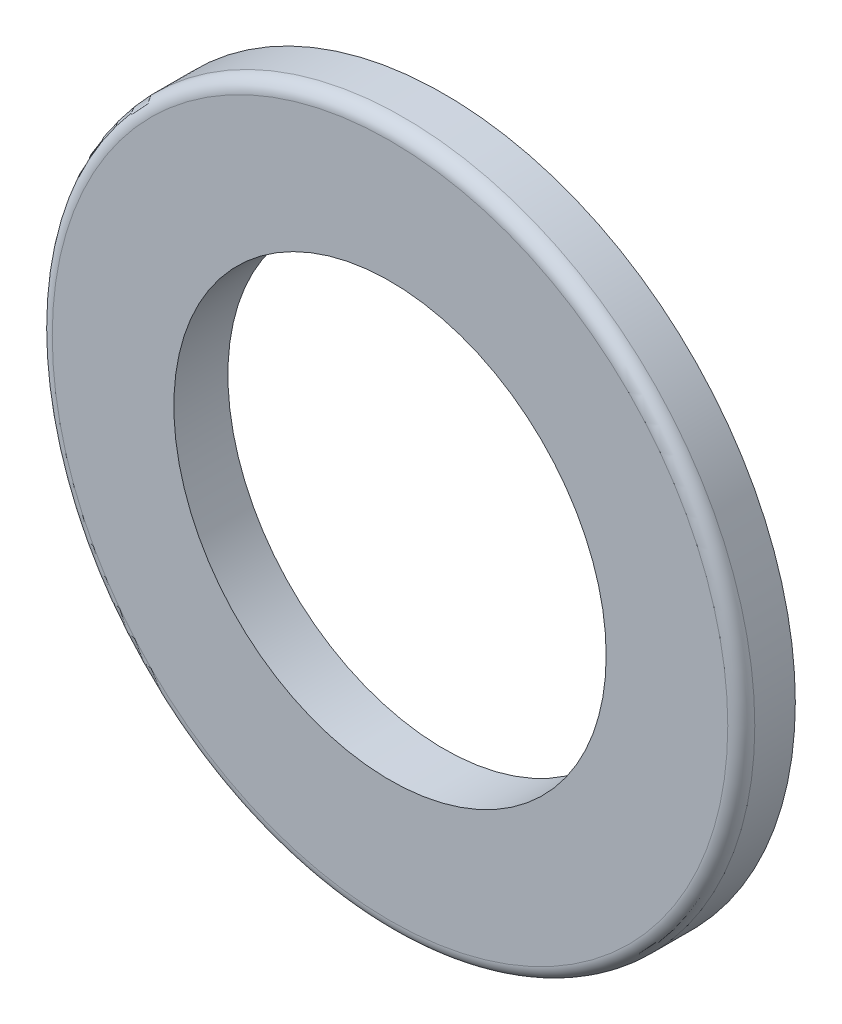
ISO-10303-21;
HEADER;
FILE_DESCRIPTION(('STEP AP214'),'2;1');
FILE_NAME('part.step','',(''),(''),'','','');
FILE_SCHEMA(('AUTOMOTIVE_DESIGN { 1 0 10303 214 1 1 1 1 }'));
ENDSEC;
DATA;
#1=APPLICATION_CONTEXT('core data for automotive mechanical design processes');
#2=APPLICATION_PROTOCOL_DEFINITION('international standard','automotive_design',2000,#1);
#3=PRODUCT_CONTEXT('',#1,'mechanical');
#4=PRODUCT('Part','Part','',(#3));
#5=PRODUCT_RELATED_PRODUCT_CATEGORY('part','',(#4));
#6=PRODUCT_DEFINITION_FORMATION('','',#4);
#7=PRODUCT_DEFINITION_CONTEXT('part definition',#1,'design');
#8=PRODUCT_DEFINITION('design','',#6,#7);
#9=PRODUCT_DEFINITION_SHAPE('','',#8);
#10=(LENGTH_UNIT() NAMED_UNIT(*) SI_UNIT(.MILLI.,.METRE.));
#11=(NAMED_UNIT(*) PLANE_ANGLE_UNIT() SI_UNIT($,.RADIAN.));
#12=(NAMED_UNIT(*) SI_UNIT($,.STERADIAN.) SOLID_ANGLE_UNIT());
#13=UNCERTAINTY_MEASURE_WITH_UNIT(LENGTH_MEASURE(1.E-05),#10,'distance_accuracy_value','');
#14=(GEOMETRIC_REPRESENTATION_CONTEXT(3) GLOBAL_UNCERTAINTY_ASSIGNED_CONTEXT((#13)) GLOBAL_UNIT_ASSIGNED_CONTEXT((#10,
#11,#12)) REPRESENTATION_CONTEXT('',''));
#15=CARTESIAN_POINT('',(0.,0.,0.));
#16=DIRECTION('',(0.,0.,1.));
#17=DIRECTION('',(1.,0.,0.));
#18=AXIS2_PLACEMENT_3D('',#15,#16,#17);
#19=CARTESIAN_POINT('',(0.,0.,2.));
#20=DIRECTION('',(0.,0.,1.));
#21=DIRECTION('',(1.,0.,0.));
#22=AXIS2_PLACEMENT_3D('',#19,#20,#21);
#23=PLANE('',#22);
#24=CARTESIAN_POINT('',(0.,0.,2.));
#25=DIRECTION('',(0.,0.,1.));
#26=DIRECTION('',(1.,0.,0.));
#27=AXIS2_PLACEMENT_3D('',#24,#25,#26);
#28=CIRCLE('',#27,12.5);
#29=CARTESIAN_POINT('',(12.5,0.,2.));
#30=VERTEX_POINT('',#29);
#31=EDGE_CURVE('E51',#30,#30,#28,.T.);
#32=ORIENTED_EDGE('',*,*,#31,.T.);
#33=EDGE_LOOP('',(#32));
#34=FACE_BOUND('',#33,.T.);
#35=CARTESIAN_POINT('',(0.,0.,2.));
#36=DIRECTION('',(0.,0.,1.));
#37=DIRECTION('',(1.,0.,0.));
#38=AXIS2_PLACEMENT_3D('',#35,#36,#37);
#39=CIRCLE('',#38,8.);
#40=CARTESIAN_POINT('',(8.,0.,2.));
#41=VERTEX_POINT('',#40);
#42=EDGE_CURVE('E61',#41,#41,#39,.T.);
#43=ORIENTED_EDGE('',*,*,#42,.F.);
#44=EDGE_LOOP('',(#43));
#45=FACE_BOUND('',#44,.T.);
#46=ADVANCED_FACE('F43',(#34,#45),#23,.T.);
#47=CARTESIAN_POINT('',(0.,0.,0.));
#48=DIRECTION('',(0.,0.,1.));
#49=DIRECTION('',(1.,0.,0.));
#50=AXIS2_PLACEMENT_3D('',#47,#48,#49);
#51=PLANE('',#50);
#52=CARTESIAN_POINT('',(0.,0.,0.));
#53=DIRECTION('',(0.,0.,1.));
#54=DIRECTION('',(1.,0.,0.));
#55=AXIS2_PLACEMENT_3D('',#52,#53,#54);
#56=CIRCLE('',#55,13.);
#57=CARTESIAN_POINT('',(13.,0.,0.));
#58=VERTEX_POINT('',#57);
#59=EDGE_CURVE('E56',#58,#58,#56,.T.);
#60=ORIENTED_EDGE('',*,*,#59,.F.);
#61=EDGE_LOOP('',(#60));
#62=FACE_BOUND('',#61,.T.);
#63=CARTESIAN_POINT('',(0.,0.,0.));
#64=DIRECTION('',(0.,0.,1.));
#65=DIRECTION('',(1.,0.,0.));
#66=AXIS2_PLACEMENT_3D('',#63,#64,#65);
#67=CIRCLE('',#66,8.);
#68=CARTESIAN_POINT('',(8.,0.,0.));
#69=VERTEX_POINT('',#68);
#70=EDGE_CURVE('E64',#69,#69,#67,.T.);
#71=ORIENTED_EDGE('',*,*,#70,.T.);
#72=EDGE_LOOP('',(#71));
#73=FACE_BOUND('',#72,.T.);
#74=ADVANCED_FACE('F76',(#62,#73),#51,.F.);
#75=CARTESIAN_POINT('',(0.,0.,2.));
#76=DIRECTION('',(0.,0.,-1.));
#77=DIRECTION('',(-1.,0.,0.));
#78=AXIS2_PLACEMENT_3D('',#75,#76,#77);
#79=CYLINDRICAL_SURFACE('',#78,13.);
#80=CARTESIAN_POINT('',(0.,0.,1.5));
#81=DIRECTION('',(0.,0.,1.));
#82=DIRECTION('',(1.,0.,0.));
#83=AXIS2_PLACEMENT_3D('',#80,#81,#82);
#84=CIRCLE('',#83,13.);
#85=CARTESIAN_POINT('',(13.,0.,1.5));
#86=VERTEX_POINT('',#85);
#87=EDGE_CURVE('E11',#86,#86,#84,.F.);
#88=ORIENTED_EDGE('',*,*,#87,.T.);
#89=EDGE_LOOP('',(#88));
#90=FACE_BOUND('',#89,.T.);
#91=ORIENTED_EDGE('',*,*,#59,.T.);
#92=EDGE_LOOP('',(#91));
#93=FACE_BOUND('',#92,.T.);
#94=ADVANCED_FACE('F81',(#90,#93),#79,.T.);
#95=CARTESIAN_POINT('',(0.,0.,2.));
#96=DIRECTION('',(0.,0.,-1.));
#97=DIRECTION('',(-1.,0.,0.));
#98=AXIS2_PLACEMENT_3D('',#95,#96,#97);
#99=CYLINDRICAL_SURFACE('',#98,8.);
#100=ORIENTED_EDGE('',*,*,#42,.T.);
#101=EDGE_LOOP('',(#100));
#102=FACE_BOUND('',#101,.T.);
#103=ORIENTED_EDGE('',*,*,#70,.F.);
#104=EDGE_LOOP('',(#103));
#105=FACE_BOUND('',#104,.T.);
#106=ADVANCED_FACE('F72',(#102,#105),#99,.F.);
#107=CARTESIAN_POINT('',(0.,0.,1.5));
#108=DIRECTION('',(0.,0.,1.));
#109=DIRECTION('',(1.,0.,0.));
#110=AXIS2_PLACEMENT_3D('',#107,#108,#109);
#111=TOROIDAL_SURFACE('',#110,12.5,0.5);
#112=ORIENTED_EDGE('',*,*,#87,.F.);
#113=EDGE_LOOP('',(#112));
#114=FACE_BOUND('',#113,.T.);
#115=ORIENTED_EDGE('',*,*,#31,.F.);
#116=EDGE_LOOP('',(#115));
#117=FACE_BOUND('',#116,.T.);
#118=ADVANCED_FACE('F45',(#114,#117),#111,.T.);
#119=CLOSED_SHELL('',(#46,#74,#94,#106,#118));
#120=MANIFOLD_SOLID_BREP('B2',#119);
#121=ADVANCED_BREP_SHAPE_REPRESENTATION('',(#18,#120),#14);
#122=SHAPE_DEFINITION_REPRESENTATION(#9,#121);
ENDSEC;
END-ISO-10303-21;
